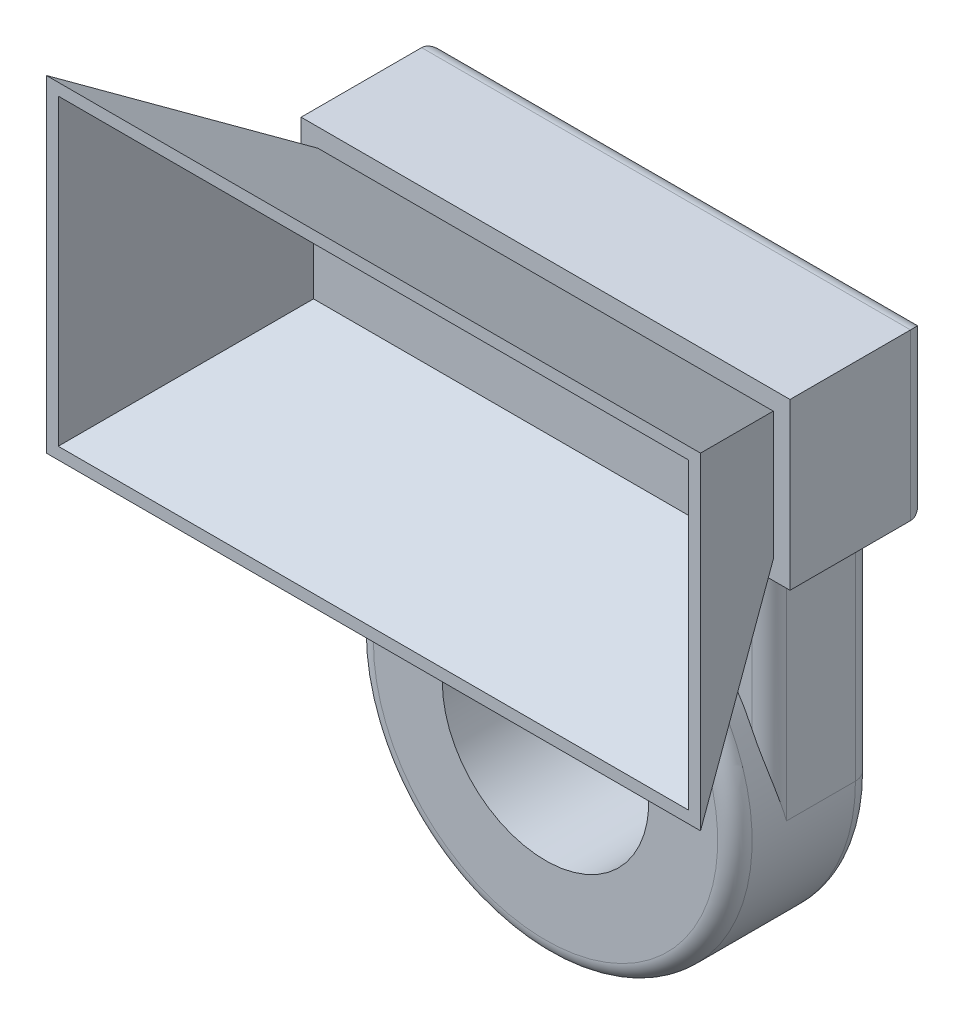
ISO-10303-21;
HEADER;
FILE_DESCRIPTION(('STEP AP214'),'2;1');
FILE_NAME('part.step','',(''),(''),'','','');
FILE_SCHEMA(('AUTOMOTIVE_DESIGN { 1 0 10303 214 1 1 1 1 }'));
ENDSEC;
DATA;
#1=APPLICATION_CONTEXT('core data for automotive mechanical design processes');
#2=APPLICATION_PROTOCOL_DEFINITION('international standard','automotive_design',2000,#1);
#3=PRODUCT_CONTEXT('',#1,'mechanical');
#4=PRODUCT('Part','Part','',(#3));
#5=PRODUCT_RELATED_PRODUCT_CATEGORY('part','',(#4));
#6=PRODUCT_DEFINITION_FORMATION('','',#4);
#7=PRODUCT_DEFINITION_CONTEXT('part definition',#1,'design');
#8=PRODUCT_DEFINITION('design','',#6,#7);
#9=PRODUCT_DEFINITION_SHAPE('','',#8);
#10=(LENGTH_UNIT() NAMED_UNIT(*) SI_UNIT(.MILLI.,.METRE.));
#11=(NAMED_UNIT(*) PLANE_ANGLE_UNIT() SI_UNIT($,.RADIAN.));
#12=(NAMED_UNIT(*) SI_UNIT($,.STERADIAN.) SOLID_ANGLE_UNIT());
#13=UNCERTAINTY_MEASURE_WITH_UNIT(LENGTH_MEASURE(1.E-05),#10,'distance_accuracy_value','');
#14=(GEOMETRIC_REPRESENTATION_CONTEXT(3) GLOBAL_UNCERTAINTY_ASSIGNED_CONTEXT((#13)) GLOBAL_UNIT_ASSIGNED_CONTEXT((#10,
#11,#12)) REPRESENTATION_CONTEXT('',''));
#15=CARTESIAN_POINT('',(0.,0.,0.));
#16=DIRECTION('',(0.,0.,1.));
#17=DIRECTION('',(1.,0.,0.));
#18=AXIS2_PLACEMENT_3D('',#15,#16,#17);
#19=CARTESIAN_POINT('',(0.,0.,-50.));
#20=DIRECTION('',(0.,0.,-1.));
#21=DIRECTION('',(-1.,0.,0.));
#22=AXIS2_PLACEMENT_3D('',#19,#20,#21);
#23=PLANE('',#22);
#24=CARTESIAN_POINT('',(0.,-97.5,-50.));
#25=DIRECTION('',(0.,0.,-1.));
#26=DIRECTION('',(-1.,0.,0.));
#27=AXIS2_PLACEMENT_3D('',#24,#25,#26);
#28=CIRCLE('',#27,50.);
#29=CARTESIAN_POINT('',(-50.,-97.5,-50.));
#30=VERTEX_POINT('',#29);
#31=EDGE_CURVE('E352',#30,#30,#28,.F.);
#32=ORIENTED_EDGE('',*,*,#31,.T.);
#33=EDGE_LOOP('',(#32));
#34=FACE_BOUND('',#33,.T.);
#35=CARTESIAN_POINT('',(0.,-97.5,-50.));
#36=DIRECTION('',(0.,0.,-1.));
#37=DIRECTION('',(-1.,0.,0.));
#38=AXIS2_PLACEMENT_3D('',#35,#36,#37);
#39=CIRCLE('',#38,30.);
#40=CARTESIAN_POINT('',(-30.,-97.5,-50.));
#41=VERTEX_POINT('',#40);
#42=EDGE_CURVE('E323',#41,#41,#39,.F.);
#43=ORIENTED_EDGE('',*,*,#42,.F.);
#44=EDGE_LOOP('',(#43));
#45=FACE_BOUND('',#44,.T.);
#46=ADVANCED_FACE('F34',(#34,#45),#23,.F.);
#47=CARTESIAN_POINT('',(55.,-97.5,-259.151559259736));
#48=DIRECTION('',(1.,0.,0.));
#49=DIRECTION('',(0.,1.,0.));
#50=AXIS2_PLACEMENT_3D('',#47,#48,#49);
#51=PLANE('',#50);
#52=DIRECTION('',(0.,0.,1.));
#53=VECTOR('',#52,1.);
#54=CARTESIAN_POINT('',(55.,-24.,-259.151559259736));
#55=LINE('',#54,#53);
#56=CARTESIAN_POINT('',(55.,-24.,-85.));
#57=VERTEX_POINT('',#56);
#58=CARTESIAN_POINT('',(55.,-24.,-65.));
#59=VERTEX_POINT('',#58);
#60=EDGE_CURVE('E343',#57,#59,#55,.T.);
#61=ORIENTED_EDGE('',*,*,#60,.T.);
#62=DIRECTION('',(0.,1.,0.));
#63=VECTOR('',#62,1.);
#64=CARTESIAN_POINT('',(55.,-97.5,-65.));
#65=LINE('',#64,#63);
#66=CARTESIAN_POINT('',(55.,-97.5,-65.));
#67=VERTEX_POINT('',#66);
#68=EDGE_CURVE('E349',#59,#67,#65,.F.);
#69=ORIENTED_EDGE('',*,*,#68,.T.);
#70=DIRECTION('',(0.,0.,1.));
#71=VECTOR('',#70,1.);
#72=CARTESIAN_POINT('',(55.,-97.5,-259.151559259736));
#73=LINE('',#72,#71);
#74=CARTESIAN_POINT('',(55.,-97.5,-85.));
#75=VERTEX_POINT('',#74);
#76=EDGE_CURVE('E209',#75,#67,#73,.T.);
#77=ORIENTED_EDGE('',*,*,#76,.F.);
#78=DIRECTION('',(0.,1.,0.));
#79=VECTOR('',#78,1.);
#80=CARTESIAN_POINT('',(55.,-97.5,-85.));
#81=LINE('',#80,#79);
#82=EDGE_CURVE('E310',#75,#57,#81,.T.);
#83=ORIENTED_EDGE('',*,*,#82,.T.);
#84=EDGE_LOOP('',(#61,#69,#77,#83));
#85=FACE_BOUND('',#84,.T.);
#86=ADVANCED_FACE('F393',(#85),#51,.T.);
#87=CARTESIAN_POINT('',(-55.,-24.,-259.151559259736));
#88=DIRECTION('',(-1.,0.,0.));
#89=DIRECTION('',(0.,-1.,0.));
#90=AXIS2_PLACEMENT_3D('',#87,#88,#89);
#91=PLANE('',#90);
#92=DIRECTION('',(0.,0.,1.));
#93=VECTOR('',#92,1.);
#94=CARTESIAN_POINT('',(-55.,-97.5,-259.151559259736));
#95=LINE('',#94,#93);
#96=CARTESIAN_POINT('',(-55.,-97.5,-85.));
#97=VERTEX_POINT('',#96);
#98=CARTESIAN_POINT('',(-55.,-97.5,-65.));
#99=VERTEX_POINT('',#98);
#100=EDGE_CURVE('E212',#97,#99,#95,.T.);
#101=ORIENTED_EDGE('',*,*,#100,.T.);
#102=DIRECTION('',(0.,-1.,0.));
#103=VECTOR('',#102,1.);
#104=CARTESIAN_POINT('',(-55.,-24.,-65.));
#105=LINE('',#104,#103);
#106=CARTESIAN_POINT('',(-55.,-24.,-65.));
#107=VERTEX_POINT('',#106);
#108=EDGE_CURVE('E49',#99,#107,#105,.F.);
#109=ORIENTED_EDGE('',*,*,#108,.T.);
#110=DIRECTION('',(0.,0.,1.));
#111=VECTOR('',#110,1.);
#112=CARTESIAN_POINT('',(-55.,-24.,-259.151559259736));
#113=LINE('',#112,#111);
#114=CARTESIAN_POINT('',(-55.,-24.,-85.));
#115=VERTEX_POINT('',#114);
#116=EDGE_CURVE('E513',#115,#107,#113,.T.);
#117=ORIENTED_EDGE('',*,*,#116,.F.);
#118=DIRECTION('',(0.,-1.,0.));
#119=VECTOR('',#118,1.);
#120=CARTESIAN_POINT('',(-55.,-24.,-85.));
#121=LINE('',#120,#119);
#122=EDGE_CURVE('E306',#115,#97,#121,.T.);
#123=ORIENTED_EDGE('',*,*,#122,.T.);
#124=EDGE_LOOP('',(#101,#109,#117,#123));
#125=FACE_BOUND('',#124,.T.);
#126=ADVANCED_FACE('F399',(#125),#91,.T.);
#127=CARTESIAN_POINT('',(95.,47.5,0.));
#128=DIRECTION('',(0.866025403784438,0.,-0.500000000000001));
#129=DIRECTION('',(-0.500000000000001,0.,-0.866025403784438));
#130=AXIS2_PLACEMENT_3D('',#127,#128,#129);
#131=PLANE('',#130);
#132=DIRECTION('',(0.,1.,0.));
#133=VECTOR('',#132,1.);
#134=CARTESIAN_POINT('',(95.,47.5,0.));
#135=LINE('',#134,#133);
#136=CARTESIAN_POINT('',(95.,-47.5,0.));
#137=VERTEX_POINT('',#136);
#138=CARTESIAN_POINT('',(95.,47.5,0.));
#139=VERTEX_POINT('',#138);
#140=EDGE_CURVE('E225',#137,#139,#135,.T.);
#141=ORIENTED_EDGE('',*,*,#140,.F.);
#142=DIRECTION('',(0.447213595499959,-0.447213595499959,0.774596669241482));
#143=VECTOR('',#142,1.);
#144=CARTESIAN_POINT('',(56.9999999999999,-9.49999999999988,-65.8179306876174));
#145=LINE('',#144,#143);
#146=CARTESIAN_POINT('',(66.1324865405186,-18.6324865405186,-50.));
#147=VERTEX_POINT('',#146);
#148=EDGE_CURVE('E267',#147,#137,#145,.T.);
#149=ORIENTED_EDGE('',*,*,#148,.F.);
#150=DIRECTION('',(0.,1.,0.));
#151=VECTOR('',#150,1.);
#152=CARTESIAN_POINT('',(66.1324865405186,0.,-50.));
#153=LINE('',#152,#151);
#154=CARTESIAN_POINT('',(66.1324865405186,18.6324865405186,-50.));
#155=VERTEX_POINT('',#154);
#156=EDGE_CURVE('E266',#147,#155,#153,.T.);
#157=ORIENTED_EDGE('',*,*,#156,.T.);
#158=DIRECTION('',(0.447213595499959,0.447213595499959,0.774596669241483));
#159=VECTOR('',#158,1.);
#160=CARTESIAN_POINT('',(95.,47.5,0.));
#161=LINE('',#160,#159);
#162=EDGE_CURVE('E271',#155,#139,#161,.T.);
#163=ORIENTED_EDGE('',*,*,#162,.T.);
#164=EDGE_LOOP('',(#141,#149,#157,#163));
#165=FACE_BOUND('',#164,.T.);
#166=ADVANCED_FACE('F420',(#165),#131,.T.);
#167=CARTESIAN_POINT('',(-95.,-47.5,0.));
#168=DIRECTION('',(0.,-0.866025403784438,-0.500000000000001));
#169=DIRECTION('',(0.,0.500000000000001,-0.866025403784438));
#170=AXIS2_PLACEMENT_3D('',#167,#168,#169);
#171=PLANE('',#170);
#172=DIRECTION('',(1.,0.,0.));
#173=VECTOR('',#172,1.);
#174=CARTESIAN_POINT('',(-95.,-47.5,0.));
#175=LINE('',#174,#173);
#176=CARTESIAN_POINT('',(-95.,-47.5,0.));
#177=VERTEX_POINT('',#176);
#178=EDGE_CURVE('E263',#177,#137,#175,.T.);
#179=ORIENTED_EDGE('',*,*,#178,.F.);
#180=DIRECTION('',(-0.447213595499959,-0.447213595499959,0.774596669241483));
#181=VECTOR('',#180,1.);
#182=CARTESIAN_POINT('',(-75.9999999999999,-28.4999999999999,-32.9089653438087));
#183=LINE('',#182,#181);
#184=CARTESIAN_POINT('',(-66.1324865405186,-18.6324865405186,-50.));
#185=VERTEX_POINT('',#184);
#186=EDGE_CURVE('E270',#185,#177,#183,.T.);
#187=ORIENTED_EDGE('',*,*,#186,.F.);
#188=DIRECTION('',(1.,0.,0.));
#189=VECTOR('',#188,1.);
#190=CARTESIAN_POINT('',(0.,-18.6324865405186,-50.));
#191=LINE('',#190,#189);
#192=EDGE_CURVE('E274',#185,#147,#191,.T.);
#193=ORIENTED_EDGE('',*,*,#192,.T.);
#194=ORIENTED_EDGE('',*,*,#148,.T.);
#195=EDGE_LOOP('',(#179,#187,#193,#194));
#196=FACE_BOUND('',#195,.T.);
#197=ADVANCED_FACE('F423',(#196),#171,.T.);
#198=CARTESIAN_POINT('',(-95.,47.5,0.));
#199=DIRECTION('',(-0.866025403784438,0.,-0.500000000000001));
#200=DIRECTION('',(-0.500000000000001,0.,0.866025403784438));
#201=AXIS2_PLACEMENT_3D('',#198,#199,#200);
#202=PLANE('',#201);
#203=DIRECTION('',(0.,-1.,0.));
#204=VECTOR('',#203,1.);
#205=CARTESIAN_POINT('',(-95.,47.5,0.));
#206=LINE('',#205,#204);
#207=CARTESIAN_POINT('',(-95.,47.5,0.));
#208=VERTEX_POINT('',#207);
#209=EDGE_CURVE('E260',#208,#177,#206,.T.);
#210=ORIENTED_EDGE('',*,*,#209,.F.);
#211=DIRECTION('',(-0.447213595499959,0.447213595499959,0.774596669241482));
#212=VECTOR('',#211,1.);
#213=CARTESIAN_POINT('',(-95.,47.5,0.));
#214=LINE('',#213,#212);
#215=CARTESIAN_POINT('',(-66.1324865405186,18.6324865405186,-50.));
#216=VERTEX_POINT('',#215);
#217=EDGE_CURVE('E273',#216,#208,#214,.T.);
#218=ORIENTED_EDGE('',*,*,#217,.F.);
#219=DIRECTION('',(0.,-1.,0.));
#220=VECTOR('',#219,1.);
#221=CARTESIAN_POINT('',(-66.1324865405186,0.,-50.));
#222=LINE('',#221,#220);
#223=EDGE_CURVE('E282',#216,#185,#222,.T.);
#224=ORIENTED_EDGE('',*,*,#223,.T.);
#225=ORIENTED_EDGE('',*,*,#186,.T.);
#226=EDGE_LOOP('',(#210,#218,#224,#225));
#227=FACE_BOUND('',#226,.T.);
#228=ADVANCED_FACE('F427',(#227),#202,.T.);
#229=CARTESIAN_POINT('',(-95.,47.5,0.));
#230=DIRECTION('',(0.,0.866025403784438,-0.500000000000001));
#231=DIRECTION('',(0.,0.500000000000001,0.866025403784438));
#232=AXIS2_PLACEMENT_3D('',#229,#230,#231);
#233=PLANE('',#232);
#234=DIRECTION('',(-1.,0.,0.));
#235=VECTOR('',#234,1.);
#236=CARTESIAN_POINT('',(-95.,47.5,0.));
#237=LINE('',#236,#235);
#238=EDGE_CURVE('E257',#139,#208,#237,.T.);
#239=ORIENTED_EDGE('',*,*,#238,.F.);
#240=ORIENTED_EDGE('',*,*,#162,.F.);
#241=DIRECTION('',(-1.,0.,0.));
#242=VECTOR('',#241,1.);
#243=CARTESIAN_POINT('',(0.,18.6324865405186,-50.));
#244=LINE('',#243,#242);
#245=EDGE_CURVE('E279',#155,#216,#244,.T.);
#246=ORIENTED_EDGE('',*,*,#245,.T.);
#247=ORIENTED_EDGE('',*,*,#217,.T.);
#248=EDGE_LOOP('',(#239,#240,#246,#247));
#249=FACE_BOUND('',#248,.T.);
#250=ADVANCED_FACE('F430',(#249),#233,.T.);
#251=CARTESIAN_POINT('',(0.,0.,0.));
#252=DIRECTION('',(0.,0.,1.));
#253=DIRECTION('',(1.,0.,0.));
#254=AXIS2_PLACEMENT_3D('',#251,#252,#253);
#255=PLANE('',#254);
#256=DIRECTION('',(0.,1.,0.));
#257=VECTOR('',#256,1.);
#258=CARTESIAN_POINT('',(91.5358983848623,0.,0.));
#259=LINE('',#258,#257);
#260=CARTESIAN_POINT('',(91.5358983848623,-44.0358983848623,0.));
#261=VERTEX_POINT('',#260);
#262=CARTESIAN_POINT('',(91.5358983848622,44.0358983848622,0.));
#263=VERTEX_POINT('',#262);
#264=EDGE_CURVE('E194',#261,#263,#259,.T.);
#265=ORIENTED_EDGE('',*,*,#264,.F.);
#266=DIRECTION('',(1.,0.,0.));
#267=VECTOR('',#266,1.);
#268=CARTESIAN_POINT('',(0.,-44.0358983848623,0.));
#269=LINE('',#268,#267);
#270=CARTESIAN_POINT('',(-91.5358983848623,-44.0358983848623,0.));
#271=VERTEX_POINT('',#270);
#272=EDGE_CURVE('E231',#271,#261,#269,.T.);
#273=ORIENTED_EDGE('',*,*,#272,.F.);
#274=DIRECTION('',(0.,-1.,0.));
#275=VECTOR('',#274,1.);
#276=CARTESIAN_POINT('',(-91.5358983848623,0.,0.));
#277=LINE('',#276,#275);
#278=CARTESIAN_POINT('',(-91.5358983848623,44.0358983848622,0.));
#279=VERTEX_POINT('',#278);
#280=EDGE_CURVE('E251',#279,#271,#277,.T.);
#281=ORIENTED_EDGE('',*,*,#280,.F.);
#282=DIRECTION('',(-1.,0.,0.));
#283=VECTOR('',#282,1.);
#284=CARTESIAN_POINT('',(0.,44.0358983848622,0.));
#285=LINE('',#284,#283);
#286=EDGE_CURVE('E248',#263,#279,#285,.T.);
#287=ORIENTED_EDGE('',*,*,#286,.F.);
#288=EDGE_LOOP('',(#265,#273,#281,#287));
#289=FACE_BOUND('',#288,.T.);
#290=ORIENTED_EDGE('',*,*,#140,.T.);
#291=ORIENTED_EDGE('',*,*,#238,.T.);
#292=ORIENTED_EDGE('',*,*,#209,.T.);
#293=ORIENTED_EDGE('',*,*,#178,.T.);
#294=EDGE_LOOP('',(#290,#291,#292,#293));
#295=FACE_BOUND('',#294,.T.);
#296=ADVANCED_FACE('F432',(#289,#295),#255,.T.);
#297=CARTESIAN_POINT('',(92.4019237886467,47.5,1.5));
#298=DIRECTION('',(0.866025403784438,0.,-0.500000000000001));
#299=DIRECTION('',(-0.500000000000001,0.,-0.866025403784438));
#300=AXIS2_PLACEMENT_3D('',#297,#298,#299);
#301=PLANE('',#300);
#302=ORIENTED_EDGE('',*,*,#264,.T.);
#303=DIRECTION('',(0.447213595499959,0.447213595499959,0.774596669241483));
#304=VECTOR('',#303,1.);
#305=CARTESIAN_POINT('',(92.9215390309173,45.4215390309173,2.4));
#306=LINE('',#305,#304);
#307=CARTESIAN_POINT('',(64.4004357329497,16.9004357329498,-47.));
#308=VERTEX_POINT('',#307);
#309=EDGE_CURVE('E232',#308,#263,#306,.T.);
#310=ORIENTED_EDGE('',*,*,#309,.F.);
#311=DIRECTION('',(0.,1.,0.));
#312=VECTOR('',#311,1.);
#313=CARTESIAN_POINT('',(64.4004357329498,0.,-47.));
#314=LINE('',#313,#312);
#315=CARTESIAN_POINT('',(64.4004357329498,-16.9004357329498,-47.));
#316=VERTEX_POINT('',#315);
#317=EDGE_CURVE('E227',#316,#308,#314,.T.);
#318=ORIENTED_EDGE('',*,*,#317,.F.);
#319=DIRECTION('',(0.447213595499959,-0.447213595499959,0.774596669241482));
#320=VECTOR('',#319,1.);
#321=CARTESIAN_POINT('',(54.9215390309172,-7.42153903091723,-63.4179306876174));
#322=LINE('',#321,#320);
#323=EDGE_CURVE('E223',#316,#261,#322,.T.);
#324=ORIENTED_EDGE('',*,*,#323,.T.);
#325=EDGE_LOOP('',(#302,#310,#318,#324));
#326=FACE_BOUND('',#325,.T.);
#327=ADVANCED_FACE('F434',(#326),#301,.F.);
#328=CARTESIAN_POINT('',(-95.,-44.9019237886467,1.5));
#329=DIRECTION('',(0.,-0.866025403784438,-0.500000000000001));
#330=DIRECTION('',(0.,0.500000000000001,-0.866025403784438));
#331=AXIS2_PLACEMENT_3D('',#328,#329,#330);
#332=PLANE('',#331);
#333=ORIENTED_EDGE('',*,*,#272,.T.);
#334=ORIENTED_EDGE('',*,*,#323,.F.);
#335=DIRECTION('',(1.,0.,0.));
#336=VECTOR('',#335,1.);
#337=CARTESIAN_POINT('',(0.,-16.9004357329498,-47.));
#338=LINE('',#337,#336);
#339=CARTESIAN_POINT('',(-64.4004357329498,-16.9004357329498,-47.));
#340=VERTEX_POINT('',#339);
#341=EDGE_CURVE('E235',#340,#316,#338,.T.);
#342=ORIENTED_EDGE('',*,*,#341,.F.);
#343=DIRECTION('',(-0.447213595499959,-0.447213595499959,0.774596669241483));
#344=VECTOR('',#343,1.);
#345=CARTESIAN_POINT('',(-73.9215390309173,-26.4215390309173,-30.5089653438087));
#346=LINE('',#345,#344);
#347=EDGE_CURVE('E226',#340,#271,#346,.T.);
#348=ORIENTED_EDGE('',*,*,#347,.T.);
#349=EDGE_LOOP('',(#333,#334,#342,#348));
#350=FACE_BOUND('',#349,.T.);
#351=ADVANCED_FACE('F441',(#350),#332,.F.);
#352=CARTESIAN_POINT('',(-92.4019237886467,47.5,1.5));
#353=DIRECTION('',(-0.866025403784438,0.,-0.500000000000001));
#354=DIRECTION('',(-0.500000000000001,0.,0.866025403784438));
#355=AXIS2_PLACEMENT_3D('',#352,#353,#354);
#356=PLANE('',#355);
#357=ORIENTED_EDGE('',*,*,#280,.T.);
#358=ORIENTED_EDGE('',*,*,#347,.F.);
#359=DIRECTION('',(0.,-1.,0.));
#360=VECTOR('',#359,1.);
#361=CARTESIAN_POINT('',(-64.4004357329498,0.,-47.));
#362=LINE('',#361,#360);
#363=CARTESIAN_POINT('',(-64.4004357329498,16.9004357329498,-47.));
#364=VERTEX_POINT('',#363);
#365=EDGE_CURVE('E240',#364,#340,#362,.T.);
#366=ORIENTED_EDGE('',*,*,#365,.F.);
#367=DIRECTION('',(-0.447213595499959,0.447213595499959,0.774596669241482));
#368=VECTOR('',#367,1.);
#369=CARTESIAN_POINT('',(-92.9215390309174,45.4215390309173,2.4));
#370=LINE('',#369,#368);
#371=EDGE_CURVE('E234',#364,#279,#370,.T.);
#372=ORIENTED_EDGE('',*,*,#371,.T.);
#373=EDGE_LOOP('',(#357,#358,#366,#372));
#374=FACE_BOUND('',#373,.T.);
#375=ADVANCED_FACE('F720',(#374),#356,.F.);
#376=CARTESIAN_POINT('',(-95.,44.9019237886467,1.5));
#377=DIRECTION('',(0.,0.866025403784438,-0.500000000000001));
#378=DIRECTION('',(0.,0.500000000000001,0.866025403784438));
#379=AXIS2_PLACEMENT_3D('',#376,#377,#378);
#380=PLANE('',#379);
#381=ORIENTED_EDGE('',*,*,#286,.T.);
#382=ORIENTED_EDGE('',*,*,#371,.F.);
#383=DIRECTION('',(-1.,0.,0.));
#384=VECTOR('',#383,1.);
#385=CARTESIAN_POINT('',(0.,16.9004357329498,-47.));
#386=LINE('',#385,#384);
#387=EDGE_CURVE('E230',#308,#364,#386,.T.);
#388=ORIENTED_EDGE('',*,*,#387,.F.);
#389=ORIENTED_EDGE('',*,*,#309,.T.);
#390=EDGE_LOOP('',(#381,#382,#388,#389));
#391=FACE_BOUND('',#390,.T.);
#392=ADVANCED_FACE('F723',(#391),#380,.F.);
#393=CARTESIAN_POINT('',(0.,0.,-47.));
#394=DIRECTION('',(0.,0.,1.));
#395=DIRECTION('',(1.,0.,0.));
#396=AXIS2_PLACEMENT_3D('',#393,#394,#395);
#397=PLANE('',#396);
#398=ORIENTED_EDGE('',*,*,#317,.T.);
#399=ORIENTED_EDGE('',*,*,#387,.T.);
#400=ORIENTED_EDGE('',*,*,#365,.T.);
#401=ORIENTED_EDGE('',*,*,#341,.T.);
#402=EDGE_LOOP('',(#398,#399,#400,#401));
#403=FACE_BOUND('',#402,.T.);
#404=ADVANCED_FACE('F448',(#403),#397,.T.);
#405=CARTESIAN_POINT('',(-71.,24.,-90.));
#406=DIRECTION('',(1.,0.,0.));
#407=DIRECTION('',(0.,1.,0.));
#408=AXIS2_PLACEMENT_3D('',#405,#406,#407);
#409=PLANE('',#408);
#410=DIRECTION('',(0.,0.,1.));
#411=VECTOR('',#410,1.);
#412=CARTESIAN_POINT('',(-71.,24.,-90.));
#413=LINE('',#412,#411);
#414=CARTESIAN_POINT('',(-71.,24.,-85.));
#415=VERTEX_POINT('',#414);
#416=CARTESIAN_POINT('',(-71.,24.,-50.));
#417=VERTEX_POINT('',#416);
#418=EDGE_CURVE('E183',#415,#417,#413,.T.);
#419=ORIENTED_EDGE('',*,*,#418,.F.);
#420=DIRECTION('',(0.,1.,0.));
#421=VECTOR('',#420,1.);
#422=CARTESIAN_POINT('',(-71.,-24.,-85.));
#423=LINE('',#422,#421);
#424=CARTESIAN_POINT('',(-71.,-24.,-85.));
#425=VERTEX_POINT('',#424);
#426=EDGE_CURVE('E317',#415,#425,#423,.F.);
#427=ORIENTED_EDGE('',*,*,#426,.T.);
#428=DIRECTION('',(0.,0.,1.));
#429=VECTOR('',#428,1.);
#430=CARTESIAN_POINT('',(-71.,-24.,-90.));
#431=LINE('',#430,#429);
#432=CARTESIAN_POINT('',(-71.,-24.,-50.));
#433=VERTEX_POINT('',#432);
#434=EDGE_CURVE('E208',#425,#433,#431,.T.);
#435=ORIENTED_EDGE('',*,*,#434,.T.);
#436=DIRECTION('',(0.,1.,0.));
#437=VECTOR('',#436,1.);
#438=CARTESIAN_POINT('',(-71.,24.,-50.));
#439=LINE('',#438,#437);
#440=EDGE_CURVE('E201',#433,#417,#439,.T.);
#441=ORIENTED_EDGE('',*,*,#440,.T.);
#442=EDGE_LOOP('',(#419,#427,#435,#441));
#443=FACE_BOUND('',#442,.T.);
#444=ADVANCED_FACE('F206',(#443),#409,.F.);
#445=CARTESIAN_POINT('',(71.,24.,-90.));
#446=DIRECTION('',(0.,-1.,0.));
#447=DIRECTION('',(0.,0.,-1.));
#448=AXIS2_PLACEMENT_3D('',#445,#446,#447);
#449=PLANE('',#448);
#450=DIRECTION('',(0.,0.,1.));
#451=VECTOR('',#450,1.);
#452=CARTESIAN_POINT('',(71.,24.,-90.));
#453=LINE('',#452,#451);
#454=CARTESIAN_POINT('',(71.,24.,-85.));
#455=VERTEX_POINT('',#454);
#456=CARTESIAN_POINT('',(71.,24.,-50.));
#457=VERTEX_POINT('',#456);
#458=EDGE_CURVE('E195',#455,#457,#453,.T.);
#459=ORIENTED_EDGE('',*,*,#458,.F.);
#460=DIRECTION('',(1.,0.,0.));
#461=VECTOR('',#460,1.);
#462=CARTESIAN_POINT('',(-71.,24.,-85.));
#463=LINE('',#462,#461);
#464=EDGE_CURVE('E190',#455,#415,#463,.F.);
#465=ORIENTED_EDGE('',*,*,#464,.T.);
#466=ORIENTED_EDGE('',*,*,#418,.T.);
#467=DIRECTION('',(1.,0.,0.));
#468=VECTOR('',#467,1.);
#469=CARTESIAN_POINT('',(71.,24.,-50.));
#470=LINE('',#469,#468);
#471=EDGE_CURVE('E187',#417,#457,#470,.T.);
#472=ORIENTED_EDGE('',*,*,#471,.T.);
#473=EDGE_LOOP('',(#459,#465,#466,#472));
#474=FACE_BOUND('',#473,.T.);
#475=ADVANCED_FACE('F186',(#474),#449,.F.);
#476=CARTESIAN_POINT('',(71.,24.,-90.));
#477=DIRECTION('',(-1.,0.,0.));
#478=DIRECTION('',(0.,0.,1.));
#479=AXIS2_PLACEMENT_3D('',#476,#477,#478);
#480=PLANE('',#479);
#481=DIRECTION('',(0.,0.,1.));
#482=VECTOR('',#481,1.);
#483=CARTESIAN_POINT('',(71.,-24.,-90.));
#484=LINE('',#483,#482);
#485=CARTESIAN_POINT('',(71.,-24.,-85.));
#486=VERTEX_POINT('',#485);
#487=CARTESIAN_POINT('',(71.,-24.,-50.));
#488=VERTEX_POINT('',#487);
#489=EDGE_CURVE('E220',#486,#488,#484,.T.);
#490=ORIENTED_EDGE('',*,*,#489,.F.);
#491=DIRECTION('',(0.,-1.,0.));
#492=VECTOR('',#491,1.);
#493=CARTESIAN_POINT('',(71.,24.,-85.));
#494=LINE('',#493,#492);
#495=EDGE_CURVE('E314',#486,#455,#494,.F.);
#496=ORIENTED_EDGE('',*,*,#495,.T.);
#497=ORIENTED_EDGE('',*,*,#458,.T.);
#498=DIRECTION('',(0.,-1.,0.));
#499=VECTOR('',#498,1.);
#500=CARTESIAN_POINT('',(71.,24.,-50.));
#501=LINE('',#500,#499);
#502=EDGE_CURVE('E203',#457,#488,#501,.T.);
#503=ORIENTED_EDGE('',*,*,#502,.T.);
#504=EDGE_LOOP('',(#490,#496,#497,#503));
#505=FACE_BOUND('',#504,.T.);
#506=ADVANCED_FACE('F500',(#505),#480,.F.);
#507=CARTESIAN_POINT('',(71.,-24.,-90.));
#508=DIRECTION('',(0.,1.,0.));
#509=DIRECTION('',(0.,0.,1.));
#510=AXIS2_PLACEMENT_3D('',#507,#508,#509);
#511=PLANE('',#510);
#512=ORIENTED_EDGE('',*,*,#434,.F.);
#513=DIRECTION('',(-1.,0.,0.));
#514=VECTOR('',#513,1.);
#515=CARTESIAN_POINT('',(-55.,-24.,-85.));
#516=LINE('',#515,#514);
#517=EDGE_CURVE('E303',#425,#115,#516,.F.);
#518=ORIENTED_EDGE('',*,*,#517,.T.);
#519=ORIENTED_EDGE('',*,*,#116,.T.);
#520=CARTESIAN_POINT('',(-50.,-24.,-65.));
#521=DIRECTION('',(0.,1.,0.));
#522=DIRECTION('',(0.,0.,1.));
#523=AXIS2_PLACEMENT_3D('',#520,#521,#522);
#524=CIRCLE('',#523,5.);
#525=CARTESIAN_POINT('',(-50.,-24.,-60.));
#526=VERTEX_POINT('',#525);
#527=EDGE_CURVE('E11',#107,#526,#524,.T.);
#528=ORIENTED_EDGE('',*,*,#527,.T.);
#529=DIRECTION('',(-1.,0.,0.));
#530=VECTOR('',#529,1.);
#531=CARTESIAN_POINT('',(-55.,-24.,-60.));
#532=LINE('',#531,#530);
#533=CARTESIAN_POINT('',(50.,-24.,-60.));
#534=VERTEX_POINT('',#533);
#535=EDGE_CURVE('E530',#534,#526,#532,.T.);
#536=ORIENTED_EDGE('',*,*,#535,.F.);
#537=CARTESIAN_POINT('',(50.,-24.,-65.));
#538=DIRECTION('',(0.,1.,0.));
#539=DIRECTION('',(0.,0.,1.));
#540=AXIS2_PLACEMENT_3D('',#537,#538,#539);
#541=CIRCLE('',#540,5.);
#542=EDGE_CURVE('E358',#534,#59,#541,.T.);
#543=ORIENTED_EDGE('',*,*,#542,.T.);
#544=ORIENTED_EDGE('',*,*,#60,.F.);
#545=DIRECTION('',(-1.,0.,0.));
#546=VECTOR('',#545,1.);
#547=CARTESIAN_POINT('',(71.,-24.,-85.));
#548=LINE('',#547,#546);
#549=EDGE_CURVE('E312',#57,#486,#548,.F.);
#550=ORIENTED_EDGE('',*,*,#549,.T.);
#551=ORIENTED_EDGE('',*,*,#489,.T.);
#552=DIRECTION('',(-1.,0.,0.));
#553=VECTOR('',#552,1.);
#554=CARTESIAN_POINT('',(71.,-24.,-50.));
#555=LINE('',#554,#553);
#556=EDGE_CURVE('E217',#488,#433,#555,.T.);
#557=ORIENTED_EDGE('',*,*,#556,.T.);
#558=EDGE_LOOP('',(#512,#518,#519,#528,#536,#543,#544,#550,#551,#557));
#559=FACE_BOUND('',#558,.T.);
#560=ADVANCED_FACE('F413',(#559),#511,.F.);
#561=CARTESIAN_POINT('',(0.,0.,-90.));
#562=DIRECTION('',(0.,0.,-1.));
#563=DIRECTION('',(-1.,0.,0.));
#564=AXIS2_PLACEMENT_3D('',#561,#562,#563);
#565=PLANE('',#564);
#566=CARTESIAN_POINT('',(0.,-97.5,-90.));
#567=DIRECTION('',(0.,0.,-1.));
#568=DIRECTION('',(-1.,0.,0.));
#569=AXIS2_PLACEMENT_3D('',#566,#567,#568);
#570=CIRCLE('',#569,30.);
#571=CARTESIAN_POINT('',(-30.,-97.5,-90.));
#572=VERTEX_POINT('',#571);
#573=EDGE_CURVE('E529',#572,#572,#570,.T.);
#574=ORIENTED_EDGE('',*,*,#573,.F.);
#575=EDGE_LOOP('',(#574));
#576=FACE_BOUND('',#575,.T.);
#577=DIRECTION('',(0.,-1.,0.));
#578=VECTOR('',#577,1.);
#579=CARTESIAN_POINT('',(-50.,0.,-90.));
#580=LINE('',#579,#578);
#581=CARTESIAN_POINT('',(-50.,-97.5,-90.));
#582=VERTEX_POINT('',#581);
#583=CARTESIAN_POINT('',(-50.,-19.,-90.));
#584=VERTEX_POINT('',#583);
#585=EDGE_CURVE('E298',#582,#584,#580,.F.);
#586=ORIENTED_EDGE('',*,*,#585,.T.);
#587=DIRECTION('',(-1.,0.,0.));
#588=VECTOR('',#587,1.);
#589=CARTESIAN_POINT('',(-71.,-19.,-90.));
#590=LINE('',#589,#588);
#591=CARTESIAN_POINT('',(-66.,-19.,-90.));
#592=VERTEX_POINT('',#591);
#593=EDGE_CURVE('E300',#584,#592,#590,.T.);
#594=ORIENTED_EDGE('',*,*,#593,.T.);
#595=DIRECTION('',(0.,1.,0.));
#596=VECTOR('',#595,1.);
#597=CARTESIAN_POINT('',(-66.,24.,-90.));
#598=LINE('',#597,#596);
#599=CARTESIAN_POINT('',(-66.,19.,-90.));
#600=VERTEX_POINT('',#599);
#601=EDGE_CURVE('E269',#592,#600,#598,.T.);
#602=ORIENTED_EDGE('',*,*,#601,.T.);
#603=DIRECTION('',(1.,0.,0.));
#604=VECTOR('',#603,1.);
#605=CARTESIAN_POINT('',(71.,19.,-90.));
#606=LINE('',#605,#604);
#607=CARTESIAN_POINT('',(66.,19.,-90.));
#608=VERTEX_POINT('',#607);
#609=EDGE_CURVE('E288',#600,#608,#606,.T.);
#610=ORIENTED_EDGE('',*,*,#609,.T.);
#611=DIRECTION('',(0.,-1.,0.));
#612=VECTOR('',#611,1.);
#613=CARTESIAN_POINT('',(66.,-24.,-90.));
#614=LINE('',#613,#612);
#615=CARTESIAN_POINT('',(66.,-19.,-90.));
#616=VERTEX_POINT('',#615);
#617=EDGE_CURVE('E290',#608,#616,#614,.T.);
#618=ORIENTED_EDGE('',*,*,#617,.T.);
#619=DIRECTION('',(-1.,0.,0.));
#620=VECTOR('',#619,1.);
#621=CARTESIAN_POINT('',(55.,-19.,-90.));
#622=LINE('',#621,#620);
#623=CARTESIAN_POINT('',(50.,-19.,-90.));
#624=VERTEX_POINT('',#623);
#625=EDGE_CURVE('E292',#616,#624,#622,.T.);
#626=ORIENTED_EDGE('',*,*,#625,.T.);
#627=DIRECTION('',(0.,1.,0.));
#628=VECTOR('',#627,1.);
#629=CARTESIAN_POINT('',(50.,0.,-90.));
#630=LINE('',#629,#628);
#631=CARTESIAN_POINT('',(50.,-97.5,-90.));
#632=VERTEX_POINT('',#631);
#633=EDGE_CURVE('E294',#624,#632,#630,.F.);
#634=ORIENTED_EDGE('',*,*,#633,.T.);
#635=CARTESIAN_POINT('',(0.,-97.5,-90.));
#636=DIRECTION('',(0.,0.,-1.));
#637=DIRECTION('',(-1.,0.,0.));
#638=AXIS2_PLACEMENT_3D('',#635,#636,#637);
#639=CIRCLE('',#638,50.);
#640=EDGE_CURVE('E296',#632,#582,#639,.T.);
#641=ORIENTED_EDGE('',*,*,#640,.T.);
#642=EDGE_LOOP('',(#586,#594,#602,#610,#618,#626,#634,#641));
#643=FACE_BOUND('',#642,.T.);
#644=ADVANCED_FACE('F406',(#576,#643),#565,.T.);
#645=ORIENTED_EDGE('',*,*,#156,.F.);
#646=ORIENTED_EDGE('',*,*,#192,.F.);
#647=ORIENTED_EDGE('',*,*,#223,.F.);
#648=ORIENTED_EDGE('',*,*,#245,.F.);
#649=EDGE_LOOP('',(#645,#646,#647,#648));
#650=FACE_BOUND('',#649,.T.);
#651=ORIENTED_EDGE('',*,*,#440,.F.);
#652=ORIENTED_EDGE('',*,*,#556,.F.);
#653=ORIENTED_EDGE('',*,*,#502,.F.);
#654=ORIENTED_EDGE('',*,*,#471,.F.);
#655=EDGE_LOOP('',(#651,#652,#653,#654));
#656=FACE_BOUND('',#655,.T.);
#657=ADVANCED_FACE('F199',(#650,#656),#23,.F.);
#658=CARTESIAN_POINT('',(0.,-97.5,-259.151559259736));
#659=DIRECTION('',(0.,0.,1.));
#660=DIRECTION('',(1.,0.,0.));
#661=AXIS2_PLACEMENT_3D('',#658,#659,#660);
#662=CYLINDRICAL_SURFACE('',#661,55.);
#663=CARTESIAN_POINT('',(0.,-97.5,-55.));
#664=DIRECTION('',(0.,0.,-1.));
#665=DIRECTION('',(-1.,0.,0.));
#666=AXIS2_PLACEMENT_3D('',#663,#664,#665);
#667=CIRCLE('',#666,55.);
#668=CARTESIAN_POINT('',(-55.,-97.5,-55.));
#669=VERTEX_POINT('',#668);
#670=EDGE_CURVE('E355',#669,#669,#667,.T.);
#671=ORIENTED_EDGE('',*,*,#670,.T.);
#672=EDGE_LOOP('',(#671));
#673=FACE_BOUND('',#672,.T.);
#674=ORIENTED_EDGE('',*,*,#100,.F.);
#675=CARTESIAN_POINT('',(0.,-97.5,-85.));
#676=DIRECTION('',(0.,0.,-1.));
#677=DIRECTION('',(-1.,0.,0.));
#678=AXIS2_PLACEMENT_3D('',#675,#676,#677);
#679=CIRCLE('',#678,55.);
#680=EDGE_CURVE('E308',#97,#75,#679,.F.);
#681=ORIENTED_EDGE('',*,*,#680,.T.);
#682=ORIENTED_EDGE('',*,*,#76,.T.);
#683=CARTESIAN_POINT('',(50.,-74.5871215252208,-60.));
#684=CARTESIAN_POINT('',(50.0884468795967,-74.7801274034559,-60.0000048680652));
#685=CARTESIAN_POINT('',(50.1757699270992,-74.9736339007318,-60.0023462796743));
#686=CARTESIAN_POINT('',(50.3481273391132,-75.3615468517509,-60.0113865672215));
#687=CARTESIAN_POINT('',(50.433161866496,-75.5559532402897,-60.0180851322077));
#688=CARTESIAN_POINT('',(50.6847175093886,-76.1402437585051,-60.0442362057566));
#689=CARTESIAN_POINT('',(50.8477670169696,-76.5313658306221,-60.0697446426194));
#690=CARTESIAN_POINT('',(51.1641026617889,-77.3155243829322,-60.1347267598122));
#691=CARTESIAN_POINT('',(51.3174058246643,-77.7085561572485,-60.1741752509213));
#692=CARTESIAN_POINT('',(51.6145034891469,-78.4968302344584,-60.2652856541512));
#693=CARTESIAN_POINT('',(51.7582969155224,-78.8920727818553,-60.3169489443445));
#694=CARTESIAN_POINT('',(52.035795545227,-79.6828483188873,-60.4307614620452));
#695=CARTESIAN_POINT('',(52.1695371651231,-80.0783744396503,-60.4928699061933));
#696=CARTESIAN_POINT('',(52.4275521748116,-80.8709441924419,-60.6264336346519));
#697=CARTESIAN_POINT('',(52.5518248457995,-81.2679879372782,-60.6978896274346));
#698=CARTESIAN_POINT('',(52.9106029026007,-82.4614349633968,-60.9246404889347));
#699=CARTESIAN_POINT('',(53.1309508489716,-83.2598187223072,-61.0922680506362));
#700=CARTESIAN_POINT('',(53.472204035685,-84.6139635786677,-61.397385398485));
#701=CARTESIAN_POINT('',(53.6028500096798,-85.1688209126499,-61.528287013614));
#702=CARTESIAN_POINT('',(53.8463956400802,-86.2799666069827,-61.8002259518969));
#703=CARTESIAN_POINT('',(53.9592944479066,-86.8362550344693,-61.9412637592424));
#704=CARTESIAN_POINT('',(54.2716041361893,-88.5068487070912,-62.3768092437405));
#705=CARTESIAN_POINT('',(54.4446433780606,-89.6229424477125,-62.6837629219928));
#706=CARTESIAN_POINT('',(54.7214377483577,-91.8579328836336,-63.3183680467601));
#707=CARTESIAN_POINT('',(54.825173297973,-92.9768302814539,-63.646025313602));
#708=CARTESIAN_POINT('',(54.963974987342,-95.2156063327271,-64.3112862837259));
#709=CARTESIAN_POINT('',(54.9990676291326,-96.3354844404056,-64.6488860972132));
#710=CARTESIAN_POINT('',(54.9999938873361,-97.4700618389712,-64.9909733062285));
#711=CARTESIAN_POINT('',(54.9999999983565,-97.485030944772,-64.995486661481));
#712=CARTESIAN_POINT('',(55.,-97.5,-65.));
#713=B_SPLINE_CURVE_WITH_KNOTS('',3,(#683,#684,#685,#686,#687,#688,#689,#690,#691,#692,#693,
#694,#695,#696,#697,#698,#699,#700,#701,#702,#703,#704,#705,#706,#707,#708,#709,#710,#711,#712),
.UNSPECIFIED.,.F.,.F.,(4,2,2,2,2,2,2,2,2,2,2,2,2,2,4),(0.,0.636881439933286,1.27371743328376,
2.54684020505862,3.81767415120616,5.08865154117354,6.35477692955444,7.62099833616709,
10.1545158631703,11.9087926059575,13.663153203832,17.1716842346372,20.6812060329867,
24.1893725879248,24.236276749106),.UNSPECIFIED.);
#714=CARTESIAN_POINT('',(50.,-74.5871215252208,-60.));
#715=VERTEX_POINT('',#714);
#716=EDGE_CURVE('E360',#67,#715,#713,.F.);
#717=ORIENTED_EDGE('',*,*,#716,.T.);
#718=CARTESIAN_POINT('',(0.,-97.5,-60.));
#719=DIRECTION('',(0.,0.,-1.));
#720=DIRECTION('',(1.,0.,0.));
#721=AXIS2_PLACEMENT_3D('',#718,#719,#720);
#722=CIRCLE('',#721,55.);
#723=CARTESIAN_POINT('',(-50.,-74.5871215252208,-60.));
#724=VERTEX_POINT('',#723);
#725=EDGE_CURVE('E524',#724,#715,#722,.T.);
#726=ORIENTED_EDGE('',*,*,#725,.F.);
#727=CARTESIAN_POINT('',(-50.,-74.5871215252208,-60.));
#728=CARTESIAN_POINT('',(-50.0884468795967,-74.7801274034559,-60.0000048680652));
#729=CARTESIAN_POINT('',(-50.1757699270992,-74.9736339007318,-60.0023462796743));
#730=CARTESIAN_POINT('',(-50.3481273391132,-75.3615468517509,-60.0113865672215));
#731=CARTESIAN_POINT('',(-50.433161866496,-75.5559532402897,-60.0180851322077));
#732=CARTESIAN_POINT('',(-50.6847175093886,-76.1402437585051,-60.0442362057566));
#733=CARTESIAN_POINT('',(-50.8477670169696,-76.5313658306221,-60.0697446426194));
#734=CARTESIAN_POINT('',(-51.1641026617889,-77.3155243829322,-60.1347267598122));
#735=CARTESIAN_POINT('',(-51.3174058246643,-77.7085561572485,-60.1741752509213));
#736=CARTESIAN_POINT('',(-51.6145034891469,-78.4968302344584,-60.2652856541512));
#737=CARTESIAN_POINT('',(-51.7582969155224,-78.8920727818553,-60.3169489443445));
#738=CARTESIAN_POINT('',(-52.035795545227,-79.6828483188873,-60.4307614620452));
#739=CARTESIAN_POINT('',(-52.1695371651231,-80.0783744396503,-60.4928699061933));
#740=CARTESIAN_POINT('',(-52.4275521748116,-80.8709441924419,-60.6264336346519));
#741=CARTESIAN_POINT('',(-52.5518248457995,-81.2679879372782,-60.6978896274346));
#742=CARTESIAN_POINT('',(-52.9106029026007,-82.4614349633968,-60.9246404889347));
#743=CARTESIAN_POINT('',(-53.1309508489716,-83.2598187223072,-61.0922680506362));
#744=CARTESIAN_POINT('',(-53.472204035685,-84.6139635786677,-61.397385398485));
#745=CARTESIAN_POINT('',(-53.6028500096798,-85.1688209126499,-61.528287013614));
#746=CARTESIAN_POINT('',(-53.8463956400802,-86.2799666069827,-61.8002259518969));
#747=CARTESIAN_POINT('',(-53.9592944479066,-86.8362550344693,-61.9412637592424));
#748=CARTESIAN_POINT('',(-54.2716041361893,-88.5068487070912,-62.3768092437405));
#749=CARTESIAN_POINT('',(-54.4446433780606,-89.6229424477125,-62.6837629219928));
#750=CARTESIAN_POINT('',(-54.7214377483577,-91.8579328836336,-63.3183680467601));
#751=CARTESIAN_POINT('',(-54.825173297973,-92.9768302814539,-63.646025313602));
#752=CARTESIAN_POINT('',(-54.963974987342,-95.2156063327271,-64.3112862837259));
#753=CARTESIAN_POINT('',(-54.9990676291326,-96.3354844404056,-64.6488860972132));
#754=CARTESIAN_POINT('',(-54.9999938873361,-97.4700618389712,-64.9909733062285));
#755=CARTESIAN_POINT('',(-54.9999999983565,-97.485030944772,-64.995486661481));
#756=CARTESIAN_POINT('',(-55.,-97.5,-65.));
#757=B_SPLINE_CURVE_WITH_KNOTS('',3,(#727,#728,#729,#730,#731,#732,#733,#734,#735,#736,#737,
#738,#739,#740,#741,#742,#743,#744,#745,#746,#747,#748,#749,#750,#751,#752,#753,#754,#755,#756),
.UNSPECIFIED.,.F.,.F.,(4,2,2,2,2,2,2,2,2,2,2,2,2,2,4),(0.,0.636881439933286,1.27371743328376,
2.54684020505862,3.81767415120616,5.08865154117354,6.35477692955444,7.62099833616709,
10.1545158631703,11.9087926059575,13.663153203832,17.1716842346372,20.6812060329867,
24.1893725879248,24.236276749106),.UNSPECIFIED.);
#758=EDGE_CURVE('E42',#724,#99,#757,.T.);
#759=ORIENTED_EDGE('',*,*,#758,.T.);
#760=EDGE_LOOP('',(#674,#681,#682,#717,#726,#759));
#761=FACE_BOUND('',#760,.T.);
#762=ADVANCED_FACE('F371',(#673,#761),#662,.T.);
#763=CARTESIAN_POINT('',(0.,-19.,-85.));
#764=DIRECTION('',(1.,0.,0.));
#765=DIRECTION('',(0.,0.,-1.));
#766=AXIS2_PLACEMENT_3D('',#763,#764,#765);
#767=CYLINDRICAL_SURFACE('',#766,5.);
#768=CARTESIAN_POINT('',(66.,-19.,-85.));
#769=DIRECTION('',(0.707106781186547,0.707106781186547,0.));
#770=DIRECTION('',(-0.707106781186547,0.707106781186547,0.));
#771=AXIS2_PLACEMENT_3D('',#768,#769,#770);
#772=ELLIPSE('',#771,7.07106781186547,5.);
#773=EDGE_CURVE('E337',#486,#616,#772,.T.);
#774=ORIENTED_EDGE('',*,*,#773,.F.);
#775=ORIENTED_EDGE('',*,*,#549,.F.);
#776=CARTESIAN_POINT('',(50.,-19.,-85.));
#777=DIRECTION('',(0.707106781186548,0.707106781186547,0.));
#778=DIRECTION('',(-0.707106781186547,0.707106781186548,0.));
#779=AXIS2_PLACEMENT_3D('',#776,#777,#778);
#780=ELLIPSE('',#779,7.07106781186547,5.);
#781=EDGE_CURVE('E340',#624,#57,#780,.F.);
#782=ORIENTED_EDGE('',*,*,#781,.F.);
#783=ORIENTED_EDGE('',*,*,#625,.F.);
#784=EDGE_LOOP('',(#774,#775,#782,#783));
#785=FACE_BOUND('',#784,.T.);
#786=ADVANCED_FACE('F382',(#785),#767,.T.);
#787=CARTESIAN_POINT('',(50.,-97.5,-85.));
#788=DIRECTION('',(0.,1.,0.));
#789=DIRECTION('',(-1.,0.,0.));
#790=AXIS2_PLACEMENT_3D('',#787,#788,#789);
#791=CYLINDRICAL_SURFACE('',#790,5.);
#792=ORIENTED_EDGE('',*,*,#781,.T.);
#793=ORIENTED_EDGE('',*,*,#82,.F.);
#794=CARTESIAN_POINT('',(50.,-97.5,-85.));
#795=DIRECTION('',(0.,-1.,0.));
#796=DIRECTION('',(0.,0.,-1.));
#797=AXIS2_PLACEMENT_3D('',#794,#795,#796);
#798=CIRCLE('',#797,5.);
#799=EDGE_CURVE('E334',#632,#75,#798,.T.);
#800=ORIENTED_EDGE('',*,*,#799,.F.);
#801=ORIENTED_EDGE('',*,*,#633,.F.);
#802=EDGE_LOOP('',(#792,#793,#800,#801));
#803=FACE_BOUND('',#802,.T.);
#804=ADVANCED_FACE('F479',(#803),#791,.T.);
#805=CARTESIAN_POINT('',(66.,0.,-85.));
#806=DIRECTION('',(0.,1.,0.));
#807=DIRECTION('',(0.,0.,1.));
#808=AXIS2_PLACEMENT_3D('',#805,#806,#807);
#809=CYLINDRICAL_SURFACE('',#808,5.);
#810=ORIENTED_EDGE('',*,*,#773,.T.);
#811=ORIENTED_EDGE('',*,*,#617,.F.);
#812=CARTESIAN_POINT('',(66.,19.,-85.));
#813=DIRECTION('',(-0.707106781186547,0.707106781186547,0.));
#814=DIRECTION('',(-0.707106781186547,-0.707106781186547,0.));
#815=AXIS2_PLACEMENT_3D('',#812,#813,#814);
#816=ELLIPSE('',#815,7.07106781186547,5.);
#817=EDGE_CURVE('E331',#455,#608,#816,.T.);
#818=ORIENTED_EDGE('',*,*,#817,.F.);
#819=ORIENTED_EDGE('',*,*,#495,.F.);
#820=EDGE_LOOP('',(#810,#811,#818,#819));
#821=FACE_BOUND('',#820,.T.);
#822=ADVANCED_FACE('F476',(#821),#809,.T.);
#823=CARTESIAN_POINT('',(0.,-97.5,-85.));
#824=DIRECTION('',(0.,0.,-1.));
#825=DIRECTION('',(-1.,0.,0.));
#826=AXIS2_PLACEMENT_3D('',#823,#824,#825);
#827=TOROIDAL_SURFACE('',#826,50.,5.);
#828=ORIENTED_EDGE('',*,*,#799,.T.);
#829=ORIENTED_EDGE('',*,*,#680,.F.);
#830=CARTESIAN_POINT('',(-50.,-97.5,-85.));
#831=DIRECTION('',(0.,1.,0.));
#832=DIRECTION('',(0.,0.,1.));
#833=AXIS2_PLACEMENT_3D('',#830,#831,#832);
#834=CIRCLE('',#833,5.);
#835=EDGE_CURVE('E328',#582,#97,#834,.T.);
#836=ORIENTED_EDGE('',*,*,#835,.F.);
#837=ORIENTED_EDGE('',*,*,#640,.F.);
#838=EDGE_LOOP('',(#828,#829,#836,#837));
#839=FACE_BOUND('',#838,.T.);
#840=ADVANCED_FACE('F472',(#839),#827,.T.);
#841=CARTESIAN_POINT('',(0.,19.,-85.));
#842=DIRECTION('',(-1.,0.,0.));
#843=DIRECTION('',(0.,0.,1.));
#844=AXIS2_PLACEMENT_3D('',#841,#842,#843);
#845=CYLINDRICAL_SURFACE('',#844,5.);
#846=ORIENTED_EDGE('',*,*,#817,.T.);
#847=ORIENTED_EDGE('',*,*,#609,.F.);
#848=CARTESIAN_POINT('',(-66.,19.,-85.));
#849=DIRECTION('',(-0.707106781186547,-0.707106781186548,0.));
#850=DIRECTION('',(0.707106781186548,-0.707106781186547,0.));
#851=AXIS2_PLACEMENT_3D('',#848,#849,#850);
#852=ELLIPSE('',#851,7.07106781186548,5.);
#853=EDGE_CURVE('E325',#415,#600,#852,.T.);
#854=ORIENTED_EDGE('',*,*,#853,.F.);
#855=ORIENTED_EDGE('',*,*,#464,.F.);
#856=EDGE_LOOP('',(#846,#847,#854,#855));
#857=FACE_BOUND('',#856,.T.);
#858=ADVANCED_FACE('F468',(#857),#845,.T.);
#859=CARTESIAN_POINT('',(-50.,-24.,-85.));
#860=DIRECTION('',(0.,-1.,0.));
#861=DIRECTION('',(1.,0.,0.));
#862=AXIS2_PLACEMENT_3D('',#859,#860,#861);
#863=CYLINDRICAL_SURFACE('',#862,5.);
#864=ORIENTED_EDGE('',*,*,#835,.T.);
#865=ORIENTED_EDGE('',*,*,#122,.F.);
#866=CARTESIAN_POINT('',(-50.,-19.,-85.));
#867=DIRECTION('',(0.707106781186548,-0.707106781186547,0.));
#868=DIRECTION('',(0.707106781186547,0.707106781186548,0.));
#869=AXIS2_PLACEMENT_3D('',#866,#867,#868);
#870=ELLIPSE('',#869,7.07106781186547,5.);
#871=EDGE_CURVE('E322',#584,#115,#870,.F.);
#872=ORIENTED_EDGE('',*,*,#871,.F.);
#873=ORIENTED_EDGE('',*,*,#585,.F.);
#874=EDGE_LOOP('',(#864,#865,#872,#873));
#875=FACE_BOUND('',#874,.T.);
#876=ADVANCED_FACE('F464',(#875),#863,.T.);
#877=CARTESIAN_POINT('',(-66.,0.,-85.));
#878=DIRECTION('',(0.,-1.,0.));
#879=DIRECTION('',(1.,0.,0.));
#880=AXIS2_PLACEMENT_3D('',#877,#878,#879);
#881=CYLINDRICAL_SURFACE('',#880,5.);
#882=ORIENTED_EDGE('',*,*,#853,.T.);
#883=ORIENTED_EDGE('',*,*,#601,.F.);
#884=CARTESIAN_POINT('',(-66.,-19.,-85.));
#885=DIRECTION('',(0.707106781186548,-0.707106781186547,0.));
#886=DIRECTION('',(-0.707106781186547,-0.707106781186548,0.));
#887=AXIS2_PLACEMENT_3D('',#884,#885,#886);
#888=ELLIPSE('',#887,7.07106781186547,5.);
#889=EDGE_CURVE('E320',#425,#592,#888,.T.);
#890=ORIENTED_EDGE('',*,*,#889,.F.);
#891=ORIENTED_EDGE('',*,*,#426,.F.);
#892=EDGE_LOOP('',(#882,#883,#890,#891));
#893=FACE_BOUND('',#892,.T.);
#894=ADVANCED_FACE('F460',(#893),#881,.T.);
#895=CARTESIAN_POINT('',(0.,-19.,-85.));
#896=DIRECTION('',(1.,0.,0.));
#897=DIRECTION('',(0.,0.,-1.));
#898=AXIS2_PLACEMENT_3D('',#895,#896,#897);
#899=CYLINDRICAL_SURFACE('',#898,5.);
#900=ORIENTED_EDGE('',*,*,#871,.T.);
#901=ORIENTED_EDGE('',*,*,#517,.F.);
#902=ORIENTED_EDGE('',*,*,#889,.T.);
#903=ORIENTED_EDGE('',*,*,#593,.F.);
#904=EDGE_LOOP('',(#900,#901,#902,#903));
#905=FACE_BOUND('',#904,.T.);
#906=ADVANCED_FACE('F456',(#905),#899,.T.);
#907=CARTESIAN_POINT('',(0.,-97.5,34.8528137423857));
#908=DIRECTION('',(0.,0.,-1.));
#909=DIRECTION('',(-1.,0.,0.));
#910=AXIS2_PLACEMENT_3D('',#907,#908,#909);
#911=CYLINDRICAL_SURFACE('',#910,30.);
#912=CARTESIAN_POINT('',(-30.,-97.5,-50.));
#913=CARTESIAN_POINT('',(-30.,-97.5,-50.4166666666667));
#914=CARTESIAN_POINT('',(-30.,-97.5,-50.8333333333333));
#915=CARTESIAN_POINT('',(-30.,-97.5,-51.6666666666667));
#916=CARTESIAN_POINT('',(-30.,-97.5,-52.0833333333333));
#917=CARTESIAN_POINT('',(-30.,-97.5,-52.9166666666667));
#918=CARTESIAN_POINT('',(-30.,-97.5,-53.3333333333333));
#919=CARTESIAN_POINT('',(-30.,-97.5,-54.1666666666667));
#920=CARTESIAN_POINT('',(-30.,-97.5,-54.5833333333333));
#921=CARTESIAN_POINT('',(-30.,-97.5,-55.4166666666667));
#922=CARTESIAN_POINT('',(-30.,-97.5,-55.8333333333333));
#923=CARTESIAN_POINT('',(-30.,-97.5,-56.6666666666667));
#924=CARTESIAN_POINT('',(-30.,-97.5,-57.0833333333333));
#925=CARTESIAN_POINT('',(-30.,-97.5,-57.9166666666667));
#926=CARTESIAN_POINT('',(-30.,-97.5,-58.3333333333333));
#927=CARTESIAN_POINT('',(-30.,-97.5,-59.1666666666667));
#928=CARTESIAN_POINT('',(-30.,-97.5,-59.5833333333333));
#929=CARTESIAN_POINT('',(-30.,-97.5,-60.4166666666667));
#930=CARTESIAN_POINT('',(-30.,-97.5,-60.8333333333333));
#931=CARTESIAN_POINT('',(-30.,-97.5,-61.6666666666667));
#932=CARTESIAN_POINT('',(-30.,-97.5,-62.0833333333333));
#933=CARTESIAN_POINT('',(-30.,-97.5,-62.9166666666667));
#934=CARTESIAN_POINT('',(-30.,-97.5,-63.3333333333333));
#935=CARTESIAN_POINT('',(-30.,-97.5,-64.1666666666666));
#936=CARTESIAN_POINT('',(-30.,-97.5,-64.5833333333333));
#937=CARTESIAN_POINT('',(-30.,-97.5,-65.4166666666667));
#938=CARTESIAN_POINT('',(-30.,-97.5,-65.8333333333333));
#939=CARTESIAN_POINT('',(-30.,-97.5,-66.6666666666667));
#940=CARTESIAN_POINT('',(-30.,-97.5,-67.0833333333333));
#941=CARTESIAN_POINT('',(-30.,-97.5,-67.9166666666667));
#942=CARTESIAN_POINT('',(-30.,-97.5,-68.3333333333333));
#943=CARTESIAN_POINT('',(-30.,-97.5,-69.1666666666667));
#944=CARTESIAN_POINT('',(-30.,-97.5,-69.5833333333333));
#945=CARTESIAN_POINT('',(-30.,-97.5,-70.4166666666667));
#946=CARTESIAN_POINT('',(-30.,-97.5,-70.8333333333333));
#947=CARTESIAN_POINT('',(-30.,-97.5,-71.6666666666667));
#948=CARTESIAN_POINT('',(-30.,-97.5,-72.0833333333333));
#949=CARTESIAN_POINT('',(-30.,-97.5,-72.9166666666667));
#950=CARTESIAN_POINT('',(-30.,-97.5,-73.3333333333333));
#951=CARTESIAN_POINT('',(-30.,-97.5,-74.1666666666667));
#952=CARTESIAN_POINT('',(-30.,-97.5,-74.5833333333333));
#953=CARTESIAN_POINT('',(-30.,-97.5,-75.4166666666667));
#954=CARTESIAN_POINT('',(-30.,-97.5,-75.8333333333333));
#955=CARTESIAN_POINT('',(-30.,-97.5,-76.6666666666667));
#956=CARTESIAN_POINT('',(-30.,-97.5,-77.0833333333333));
#957=CARTESIAN_POINT('',(-30.,-97.5,-77.9166666666666));
#958=CARTESIAN_POINT('',(-30.,-97.5,-78.3333333333333));
#959=CARTESIAN_POINT('',(-30.,-97.5,-79.1666666666666));
#960=CARTESIAN_POINT('',(-30.,-97.5,-79.5833333333333));
#961=CARTESIAN_POINT('',(-30.,-97.5,-80.4166666666667));
#962=CARTESIAN_POINT('',(-30.,-97.5,-80.8333333333333));
#963=CARTESIAN_POINT('',(-30.,-97.5,-81.6666666666667));
#964=CARTESIAN_POINT('',(-30.,-97.5,-82.0833333333333));
#965=CARTESIAN_POINT('',(-30.,-97.5,-82.9166666666667));
#966=CARTESIAN_POINT('',(-30.,-97.5,-83.3333333333333));
#967=CARTESIAN_POINT('',(-30.,-97.5,-84.1666666666667));
#968=CARTESIAN_POINT('',(-30.,-97.5,-84.5833333333333));
#969=CARTESIAN_POINT('',(-30.,-97.5,-85.4166666666667));
#970=CARTESIAN_POINT('',(-30.,-97.5,-85.8333333333333));
#971=CARTESIAN_POINT('',(-30.,-97.5,-86.6666666666667));
#972=CARTESIAN_POINT('',(-30.,-97.5,-87.0833333333333));
#973=CARTESIAN_POINT('',(-30.,-97.5,-87.9166666666667));
#974=CARTESIAN_POINT('',(-30.,-97.5,-88.3333333333333));
#975=CARTESIAN_POINT('',(-30.,-97.5,-89.1666666666667));
#976=CARTESIAN_POINT('',(-30.,-97.5,-89.5833333333333));
#977=CARTESIAN_POINT('',(-30.,-97.5,-90.));
#978=B_SPLINE_CURVE_WITH_KNOTS('',3,(#912,#913,#914,#915,#916,#917,#918,#919,#920,#921,#922,
#923,#924,#925,#926,#927,#928,#929,#930,#931,#932,#933,#934,#935,#936,#937,#938,#939,#940,#941,
#942,#943,#944,#945,#946,#947,#948,#949,#950,#951,#952,#953,#954,#955,#956,#957,#958,#959,#960,
#961,#962,#963,#964,#965,#966,#967,#968,#969,#970,#971,#972,#973,#974,#975,#976,#977),
.UNSPECIFIED.,.F.,.F.,(4,2,2,2,2,2,2,2,2,2,2,2,2,2,2,2,2,2,2,2,2,2,2,2,2,2,2,2,2,2,2,2,4),(0.,
1.25,2.5,3.75,5.,6.25000000000001,7.50000000000001,8.75000000000001,10.,11.25,12.5,13.75,15.,
16.25,17.5,18.75,20.,21.25,22.5,23.75,25.,26.25,27.5,28.75,30.,31.25,32.5,33.75,35.,36.25,37.5,
38.75,40.),.UNSPECIFIED.);
#979=EDGE_CURVE('BSEAM459',#41,#572,#978,.T.);
#980=ORIENTED_EDGE('',*,*,#42,.T.);
#981=ORIENTED_EDGE('',*,*,#573,.T.);
#982=ORIENTED_EDGE('',*,*,#979,.T.);
#983=ORIENTED_EDGE('',*,*,#979,.F.);
#984=EDGE_LOOP('',(#980,#982,#981,#983));
#985=FACE_BOUND('',#984,.T.);
#986=ADVANCED_FACE('F459',(#985),#911,.F.);
#987=CARTESIAN_POINT('',(0.,-97.5,-60.));
#988=DIRECTION('',(0.,0.,1.));
#989=DIRECTION('',(1.,0.,0.));
#990=AXIS2_PLACEMENT_3D('',#987,#988,#989);
#991=PLANE('',#990);
#992=ORIENTED_EDGE('',*,*,#725,.T.);
#993=DIRECTION('',(0.,1.,0.));
#994=VECTOR('',#993,1.);
#995=CARTESIAN_POINT('',(50.,-97.5,-60.));
#996=LINE('',#995,#994);
#997=EDGE_CURVE('E346',#715,#534,#996,.T.);
#998=ORIENTED_EDGE('',*,*,#997,.T.);
#999=ORIENTED_EDGE('',*,*,#535,.T.);
#1000=DIRECTION('',(0.,-1.,0.));
#1001=VECTOR('',#1000,1.);
#1002=CARTESIAN_POINT('',(-50.,-97.5,-60.));
#1003=LINE('',#1002,#1001);
#1004=EDGE_CURVE('E319',#526,#724,#1003,.T.);
#1005=ORIENTED_EDGE('',*,*,#1004,.T.);
#1006=EDGE_LOOP('',(#992,#998,#999,#1005));
#1007=FACE_BOUND('',#1006,.T.);
#1008=ADVANCED_FACE('F380',(#1007),#991,.T.);
#1009=CARTESIAN_POINT('',(50.,-97.5,-65.));
#1010=DIRECTION('',(0.,1.,0.));
#1011=DIRECTION('',(-1.,0.,0.));
#1012=AXIS2_PLACEMENT_3D('',#1009,#1010,#1011);
#1013=CYLINDRICAL_SURFACE('',#1012,5.);
#1014=ORIENTED_EDGE('',*,*,#716,.F.);
#1015=ORIENTED_EDGE('',*,*,#68,.F.);
#1016=ORIENTED_EDGE('',*,*,#542,.F.);
#1017=ORIENTED_EDGE('',*,*,#997,.F.);
#1018=EDGE_LOOP('',(#1014,#1015,#1016,#1017));
#1019=FACE_BOUND('',#1018,.T.);
#1020=ADVANCED_FACE('F375',(#1019),#1013,.T.);
#1021=CARTESIAN_POINT('',(-50.,-97.5,-65.));
#1022=DIRECTION('',(0.,-1.,0.));
#1023=DIRECTION('',(1.,0.,0.));
#1024=AXIS2_PLACEMENT_3D('',#1021,#1022,#1023);
#1025=CYLINDRICAL_SURFACE('',#1024,5.);
#1026=ORIENTED_EDGE('',*,*,#527,.F.);
#1027=ORIENTED_EDGE('',*,*,#108,.F.);
#1028=ORIENTED_EDGE('',*,*,#758,.F.);
#1029=ORIENTED_EDGE('',*,*,#1004,.F.);
#1030=EDGE_LOOP('',(#1026,#1027,#1028,#1029));
#1031=FACE_BOUND('',#1030,.T.);
#1032=ADVANCED_FACE('F379',(#1031),#1025,.T.);
#1033=CARTESIAN_POINT('',(0.,-97.5,-55.));
#1034=DIRECTION('',(0.,0.,-1.));
#1035=DIRECTION('',(-1.,0.,0.));
#1036=AXIS2_PLACEMENT_3D('',#1033,#1034,#1035);
#1037=TOROIDAL_SURFACE('',#1036,50.,5.);
#1038=ORIENTED_EDGE('',*,*,#670,.F.);
#1039=EDGE_LOOP('',(#1038));
#1040=FACE_BOUND('',#1039,.T.);
#1041=ORIENTED_EDGE('',*,*,#31,.F.);
#1042=EDGE_LOOP('',(#1041));
#1043=FACE_BOUND('',#1042,.T.);
#1044=ADVANCED_FACE('F36',(#1040,#1043),#1037,.T.);
#1045=CLOSED_SHELL('',(#46,#86,#126,#166,#197,#228,#250,#296,#327,#351,#375,#392,#404,#444,#475,
#506,#560,#644,#657,#762,#786,#804,#822,#840,#858,#876,#894,#906,#986,#1008,#1020,#1032,#1044));
#1046=MANIFOLD_SOLID_BREP('B2',#1045);
#1047=ADVANCED_BREP_SHAPE_REPRESENTATION('',(#18,#1046),#14);
#1048=SHAPE_DEFINITION_REPRESENTATION(#9,#1047);
ENDSEC;
END-ISO-10303-21;
